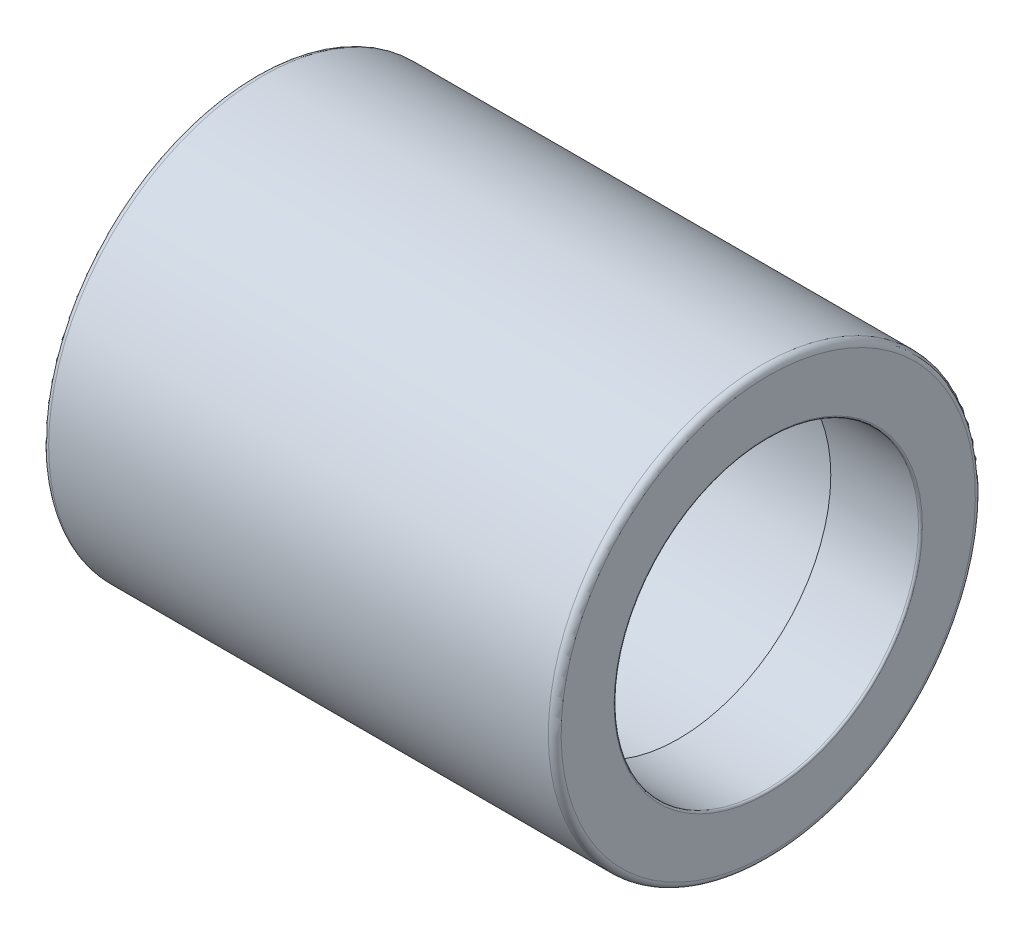
ISO-10303-21;
HEADER;
FILE_DESCRIPTION(('STEP AP214'),'2;1');
FILE_NAME('part.step','',(''),(''),'','','');
FILE_SCHEMA(('AUTOMOTIVE_DESIGN { 1 0 10303 214 1 1 1 1 }'));
ENDSEC;
DATA;
#1=APPLICATION_CONTEXT('core data for automotive mechanical design processes');
#2=APPLICATION_PROTOCOL_DEFINITION('international standard','automotive_design',2000,#1);
#3=PRODUCT_CONTEXT('',#1,'mechanical');
#4=PRODUCT('Part','Part','',(#3));
#5=PRODUCT_RELATED_PRODUCT_CATEGORY('part','',(#4));
#6=PRODUCT_DEFINITION_FORMATION('','',#4);
#7=PRODUCT_DEFINITION_CONTEXT('part definition',#1,'design');
#8=PRODUCT_DEFINITION('design','',#6,#7);
#9=PRODUCT_DEFINITION_SHAPE('','',#8);
#10=(LENGTH_UNIT() NAMED_UNIT(*) SI_UNIT(.MILLI.,.METRE.));
#11=(NAMED_UNIT(*) PLANE_ANGLE_UNIT() SI_UNIT($,.RADIAN.));
#12=(NAMED_UNIT(*) SI_UNIT($,.STERADIAN.) SOLID_ANGLE_UNIT());
#13=UNCERTAINTY_MEASURE_WITH_UNIT(LENGTH_MEASURE(1.E-05),#10,'distance_accuracy_value','');
#14=(GEOMETRIC_REPRESENTATION_CONTEXT(3) GLOBAL_UNCERTAINTY_ASSIGNED_CONTEXT((#13)) GLOBAL_UNIT_ASSIGNED_CONTEXT((#10,
#11,#12)) REPRESENTATION_CONTEXT('',''));
#15=CARTESIAN_POINT('',(0.,0.,0.));
#16=DIRECTION('',(0.,0.,1.));
#17=DIRECTION('',(1.,0.,0.));
#18=AXIS2_PLACEMENT_3D('',#15,#16,#17);
#19=CARTESIAN_POINT('',(0.045,0.,0.));
#20=DIRECTION('',(1.,0.,0.));
#21=DIRECTION('',(0.,0.,-1.));
#22=AXIS2_PLACEMENT_3D('',#19,#20,#21);
#23=TOROIDAL_SURFACE('',#22,3.61,0.045);
#24=CARTESIAN_POINT('',(0.045,0.,0.));
#25=DIRECTION('',(1.,0.,0.));
#26=DIRECTION('',(0.,1.,0.));
#27=AXIS2_PLACEMENT_3D('',#24,#25,#26);
#28=CIRCLE('',#27,3.565);
#29=CARTESIAN_POINT('',(0.045,3.565,0.));
#30=VERTEX_POINT('',#29);
#31=EDGE_CURVE('E11',#30,#30,#28,.T.);
#32=ORIENTED_EDGE('',*,*,#31,.T.);
#33=EDGE_LOOP('',(#32));
#34=FACE_BOUND('',#33,.T.);
#35=CARTESIAN_POINT('',(0.,0.,0.));
#36=DIRECTION('',(1.,0.,0.));
#37=DIRECTION('',(0.,1.,0.));
#38=AXIS2_PLACEMENT_3D('',#35,#36,#37);
#39=CIRCLE('',#38,3.61);
#40=CARTESIAN_POINT('',(0.,3.61,0.));
#41=VERTEX_POINT('',#40);
#42=EDGE_CURVE('E71',#41,#41,#39,.T.);
#43=ORIENTED_EDGE('',*,*,#42,.F.);
#44=EDGE_LOOP('',(#43));
#45=FACE_BOUND('',#44,.T.);
#46=ADVANCED_FACE('F16',(#34,#45),#23,.T.);
#47=CARTESIAN_POINT('',(1.0725,0.,0.));
#48=DIRECTION('',(-1.,0.,0.));
#49=DIRECTION('',(0.,1.,0.));
#50=AXIS2_PLACEMENT_3D('',#47,#48,#49);
#51=CYLINDRICAL_SURFACE('',#50,3.565);
#52=CARTESIAN_POINT('',(2.1,0.,0.));
#53=DIRECTION('',(1.,0.,0.));
#54=DIRECTION('',(0.,1.,0.));
#55=AXIS2_PLACEMENT_3D('',#52,#53,#54);
#56=CIRCLE('',#55,3.565);
#57=CARTESIAN_POINT('',(2.1,3.565,0.));
#58=VERTEX_POINT('',#57);
#59=EDGE_CURVE('E26',#58,#58,#56,.T.);
#60=ORIENTED_EDGE('',*,*,#59,.T.);
#61=EDGE_LOOP('',(#60));
#62=FACE_BOUND('',#61,.T.);
#63=ORIENTED_EDGE('',*,*,#31,.F.);
#64=EDGE_LOOP('',(#63));
#65=FACE_BOUND('',#64,.T.);
#66=ADVANCED_FACE('F121',(#62,#65),#51,.F.);
#67=CARTESIAN_POINT('',(2.1,3.68875,0.));
#68=DIRECTION('',(1.,0.,0.));
#69=DIRECTION('',(0.,1.,0.));
#70=AXIS2_PLACEMENT_3D('',#67,#68,#69);
#71=PLANE('',#70);
#72=CARTESIAN_POINT('',(2.1,0.,0.));
#73=DIRECTION('',(1.,0.,0.));
#74=DIRECTION('',(0.,1.,0.));
#75=AXIS2_PLACEMENT_3D('',#72,#73,#74);
#76=CIRCLE('',#75,3.8125);
#77=CARTESIAN_POINT('',(2.1,3.8125,0.));
#78=VERTEX_POINT('',#77);
#79=EDGE_CURVE('E84',#78,#78,#76,.T.);
#80=ORIENTED_EDGE('',*,*,#79,.T.);
#81=EDGE_LOOP('',(#80));
#82=FACE_BOUND('',#81,.T.);
#83=ORIENTED_EDGE('',*,*,#59,.F.);
#84=EDGE_LOOP('',(#83));
#85=FACE_BOUND('',#84,.T.);
#86=ADVANCED_FACE('F126',(#82,#85),#71,.T.);
#87=CARTESIAN_POINT('',(2.2875,0.,0.));
#88=DIRECTION('',(1.,0.,0.));
#89=DIRECTION('',(0.,0.,-1.));
#90=AXIS2_PLACEMENT_3D('',#87,#88,#89);
#91=TOROIDAL_SURFACE('',#90,3.8125,0.1875);
#92=CARTESIAN_POINT('',(2.2875,0.,0.));
#93=DIRECTION('',(1.,0.,0.));
#94=DIRECTION('',(0.,1.,0.));
#95=AXIS2_PLACEMENT_3D('',#92,#93,#94);
#96=CIRCLE('',#95,4.);
#97=CARTESIAN_POINT('',(2.2875,4.,0.));
#98=VERTEX_POINT('',#97);
#99=EDGE_CURVE('E87',#98,#98,#96,.T.);
#100=ORIENTED_EDGE('',*,*,#99,.T.);
#101=EDGE_LOOP('',(#100));
#102=FACE_BOUND('',#101,.T.);
#103=ORIENTED_EDGE('',*,*,#79,.F.);
#104=EDGE_LOOP('',(#103));
#105=FACE_BOUND('',#104,.T.);
#106=ADVANCED_FACE('F18',(#102,#105),#91,.F.);
#107=CARTESIAN_POINT('',(6.,0.,0.));
#108=DIRECTION('',(-1.,0.,0.));
#109=DIRECTION('',(0.,1.,0.));
#110=AXIS2_PLACEMENT_3D('',#107,#108,#109);
#111=CYLINDRICAL_SURFACE('',#110,4.);
#112=CARTESIAN_POINT('',(9.7125,0.,0.));
#113=DIRECTION('',(1.,0.,0.));
#114=DIRECTION('',(0.,1.,0.));
#115=AXIS2_PLACEMENT_3D('',#112,#113,#114);
#116=CIRCLE('',#115,4.);
#117=CARTESIAN_POINT('',(9.7125,4.,0.));
#118=VERTEX_POINT('',#117);
#119=EDGE_CURVE('E91',#118,#118,#116,.T.);
#120=ORIENTED_EDGE('',*,*,#119,.T.);
#121=EDGE_LOOP('',(#120));
#122=FACE_BOUND('',#121,.T.);
#123=ORIENTED_EDGE('',*,*,#99,.F.);
#124=EDGE_LOOP('',(#123));
#125=FACE_BOUND('',#124,.T.);
#126=ADVANCED_FACE('F208',(#122,#125),#111,.F.);
#127=CARTESIAN_POINT('',(9.7125,0.,0.));
#128=DIRECTION('',(1.,0.,0.));
#129=DIRECTION('',(0.,0.,-1.));
#130=AXIS2_PLACEMENT_3D('',#127,#128,#129);
#131=TOROIDAL_SURFACE('',#130,3.8125,0.1875);
#132=CARTESIAN_POINT('',(9.9,0.,0.));
#133=DIRECTION('',(1.,0.,0.));
#134=DIRECTION('',(0.,1.,0.));
#135=AXIS2_PLACEMENT_3D('',#132,#133,#134);
#136=CIRCLE('',#135,3.8125);
#137=CARTESIAN_POINT('',(9.9,3.8125,0.));
#138=VERTEX_POINT('',#137);
#139=EDGE_CURVE('E95',#138,#138,#136,.T.);
#140=ORIENTED_EDGE('',*,*,#139,.T.);
#141=EDGE_LOOP('',(#140));
#142=FACE_BOUND('',#141,.T.);
#143=ORIENTED_EDGE('',*,*,#119,.F.);
#144=EDGE_LOOP('',(#143));
#145=FACE_BOUND('',#144,.T.);
#146=ADVANCED_FACE('F199',(#142,#145),#131,.F.);
#147=CARTESIAN_POINT('',(9.9,3.68875,0.));
#148=DIRECTION('',(-1.,0.,0.));
#149=DIRECTION('',(0.,-1.,0.));
#150=AXIS2_PLACEMENT_3D('',#147,#148,#149);
#151=PLANE('',#150);
#152=CARTESIAN_POINT('',(9.9,0.,0.));
#153=DIRECTION('',(1.,0.,0.));
#154=DIRECTION('',(0.,1.,0.));
#155=AXIS2_PLACEMENT_3D('',#152,#153,#154);
#156=CIRCLE('',#155,3.565);
#157=CARTESIAN_POINT('',(9.9,3.565,0.));
#158=VERTEX_POINT('',#157);
#159=EDGE_CURVE('E96',#158,#158,#156,.T.);
#160=ORIENTED_EDGE('',*,*,#159,.T.);
#161=EDGE_LOOP('',(#160));
#162=FACE_BOUND('',#161,.T.);
#163=ORIENTED_EDGE('',*,*,#139,.F.);
#164=EDGE_LOOP('',(#163));
#165=FACE_BOUND('',#164,.T.);
#166=ADVANCED_FACE('F118',(#162,#165),#151,.T.);
#167=CARTESIAN_POINT('',(10.9275,0.,0.));
#168=DIRECTION('',(-1.,0.,0.));
#169=DIRECTION('',(0.,1.,0.));
#170=AXIS2_PLACEMENT_3D('',#167,#168,#169);
#171=CYLINDRICAL_SURFACE('',#170,3.565);
#172=CARTESIAN_POINT('',(11.955,0.,0.));
#173=DIRECTION('',(1.,0.,0.));
#174=DIRECTION('',(0.,1.,0.));
#175=AXIS2_PLACEMENT_3D('',#172,#173,#174);
#176=CIRCLE('',#175,3.565);
#177=CARTESIAN_POINT('',(11.955,3.565,0.));
#178=VERTEX_POINT('',#177);
#179=EDGE_CURVE('E83',#178,#178,#176,.T.);
#180=ORIENTED_EDGE('',*,*,#179,.T.);
#181=EDGE_LOOP('',(#180));
#182=FACE_BOUND('',#181,.T.);
#183=ORIENTED_EDGE('',*,*,#159,.F.);
#184=EDGE_LOOP('',(#183));
#185=FACE_BOUND('',#184,.T.);
#186=ADVANCED_FACE('F102',(#182,#185),#171,.F.);
#187=CARTESIAN_POINT('',(11.955,0.,0.));
#188=DIRECTION('',(1.,0.,0.));
#189=DIRECTION('',(0.,0.,-1.));
#190=AXIS2_PLACEMENT_3D('',#187,#188,#189);
#191=TOROIDAL_SURFACE('',#190,3.61,0.045);
#192=CARTESIAN_POINT('',(12.,0.,0.));
#193=DIRECTION('',(1.,0.,0.));
#194=DIRECTION('',(0.,1.,0.));
#195=AXIS2_PLACEMENT_3D('',#192,#193,#194);
#196=CIRCLE('',#195,3.61);
#197=CARTESIAN_POINT('',(12.,3.61,0.));
#198=VERTEX_POINT('',#197);
#199=EDGE_CURVE('E82',#198,#198,#196,.T.);
#200=ORIENTED_EDGE('',*,*,#199,.T.);
#201=EDGE_LOOP('',(#200));
#202=FACE_BOUND('',#201,.T.);
#203=ORIENTED_EDGE('',*,*,#179,.F.);
#204=EDGE_LOOP('',(#203));
#205=FACE_BOUND('',#204,.T.);
#206=ADVANCED_FACE('F105',(#202,#205),#191,.T.);
#207=CARTESIAN_POINT('',(12.,4.23,0.));
#208=DIRECTION('',(1.,0.,0.));
#209=DIRECTION('',(0.,1.,0.));
#210=AXIS2_PLACEMENT_3D('',#207,#208,#209);
#211=PLANE('',#210);
#212=CARTESIAN_POINT('',(12.,0.,0.));
#213=DIRECTION('',(1.,0.,0.));
#214=DIRECTION('',(0.,1.,0.));
#215=AXIS2_PLACEMENT_3D('',#212,#213,#214);
#216=CIRCLE('',#215,4.85);
#217=CARTESIAN_POINT('',(12.,4.85,0.));
#218=VERTEX_POINT('',#217);
#219=EDGE_CURVE('E80',#218,#218,#216,.T.);
#220=ORIENTED_EDGE('',*,*,#219,.T.);
#221=EDGE_LOOP('',(#220));
#222=FACE_BOUND('',#221,.T.);
#223=ORIENTED_EDGE('',*,*,#199,.F.);
#224=EDGE_LOOP('',(#223));
#225=FACE_BOUND('',#224,.T.);
#226=ADVANCED_FACE('F107',(#222,#225),#211,.T.);
#227=CARTESIAN_POINT('',(11.85,0.,0.));
#228=DIRECTION('',(1.,0.,0.));
#229=DIRECTION('',(0.,0.,-1.));
#230=AXIS2_PLACEMENT_3D('',#227,#228,#229);
#231=TOROIDAL_SURFACE('',#230,4.85,0.15);
#232=CARTESIAN_POINT('',(11.85,0.,0.));
#233=DIRECTION('',(1.,0.,0.));
#234=DIRECTION('',(0.,1.,0.));
#235=AXIS2_PLACEMENT_3D('',#232,#233,#234);
#236=CIRCLE('',#235,5.);
#237=CARTESIAN_POINT('',(11.85,5.,0.));
#238=VERTEX_POINT('',#237);
#239=EDGE_CURVE('E76',#238,#238,#236,.T.);
#240=ORIENTED_EDGE('',*,*,#239,.T.);
#241=EDGE_LOOP('',(#240));
#242=FACE_BOUND('',#241,.T.);
#243=ORIENTED_EDGE('',*,*,#219,.F.);
#244=EDGE_LOOP('',(#243));
#245=FACE_BOUND('',#244,.T.);
#246=ADVANCED_FACE('F115',(#242,#245),#231,.T.);
#247=CARTESIAN_POINT('',(6.,0.,0.));
#248=DIRECTION('',(-1.,0.,0.));
#249=DIRECTION('',(0.,1.,0.));
#250=AXIS2_PLACEMENT_3D('',#247,#248,#249);
#251=CYLINDRICAL_SURFACE('',#250,5.);
#252=CARTESIAN_POINT('',(0.15,0.,0.));
#253=DIRECTION('',(1.,0.,0.));
#254=DIRECTION('',(0.,1.,0.));
#255=AXIS2_PLACEMENT_3D('',#252,#253,#254);
#256=CIRCLE('',#255,5.);
#257=CARTESIAN_POINT('',(0.15,5.,0.));
#258=VERTEX_POINT('',#257);
#259=EDGE_CURVE('E72',#258,#258,#256,.T.);
#260=ORIENTED_EDGE('',*,*,#259,.T.);
#261=EDGE_LOOP('',(#260));
#262=FACE_BOUND('',#261,.T.);
#263=ORIENTED_EDGE('',*,*,#239,.F.);
#264=EDGE_LOOP('',(#263));
#265=FACE_BOUND('',#264,.T.);
#266=ADVANCED_FACE('F135',(#262,#265),#251,.T.);
#267=CARTESIAN_POINT('',(0.15,0.,0.));
#268=DIRECTION('',(1.,0.,0.));
#269=DIRECTION('',(0.,0.,-1.));
#270=AXIS2_PLACEMENT_3D('',#267,#268,#269);
#271=TOROIDAL_SURFACE('',#270,4.85,0.15);
#272=CARTESIAN_POINT('',(0.,0.,0.));
#273=DIRECTION('',(1.,0.,0.));
#274=DIRECTION('',(0.,1.,0.));
#275=AXIS2_PLACEMENT_3D('',#272,#273,#274);
#276=CIRCLE('',#275,4.85);
#277=CARTESIAN_POINT('',(0.,4.85,0.));
#278=VERTEX_POINT('',#277);
#279=EDGE_CURVE('E20',#278,#278,#276,.T.);
#280=ORIENTED_EDGE('',*,*,#279,.T.);
#281=EDGE_LOOP('',(#280));
#282=FACE_BOUND('',#281,.T.);
#283=ORIENTED_EDGE('',*,*,#259,.F.);
#284=EDGE_LOOP('',(#283));
#285=FACE_BOUND('',#284,.T.);
#286=ADVANCED_FACE('F68',(#282,#285),#271,.T.);
#287=CARTESIAN_POINT('',(0.,4.23,0.));
#288=DIRECTION('',(-1.,0.,0.));
#289=DIRECTION('',(0.,-1.,0.));
#290=AXIS2_PLACEMENT_3D('',#287,#288,#289);
#291=PLANE('',#290);
#292=ORIENTED_EDGE('',*,*,#42,.T.);
#293=EDGE_LOOP('',(#292));
#294=FACE_BOUND('',#293,.T.);
#295=ORIENTED_EDGE('',*,*,#279,.F.);
#296=EDGE_LOOP('',(#295));
#297=FACE_BOUND('',#296,.T.);
#298=ADVANCED_FACE('F130',(#294,#297),#291,.T.);
#299=CLOSED_SHELL('',(#46,#66,#86,#106,#126,#146,#166,#186,#206,#226,#246,#266,#286,#298));
#300=MANIFOLD_SOLID_BREP('B1',#299);
#301=ADVANCED_BREP_SHAPE_REPRESENTATION('',(#18,#300),#14);
#302=SHAPE_DEFINITION_REPRESENTATION(#9,#301);
ENDSEC;
END-ISO-10303-21;
